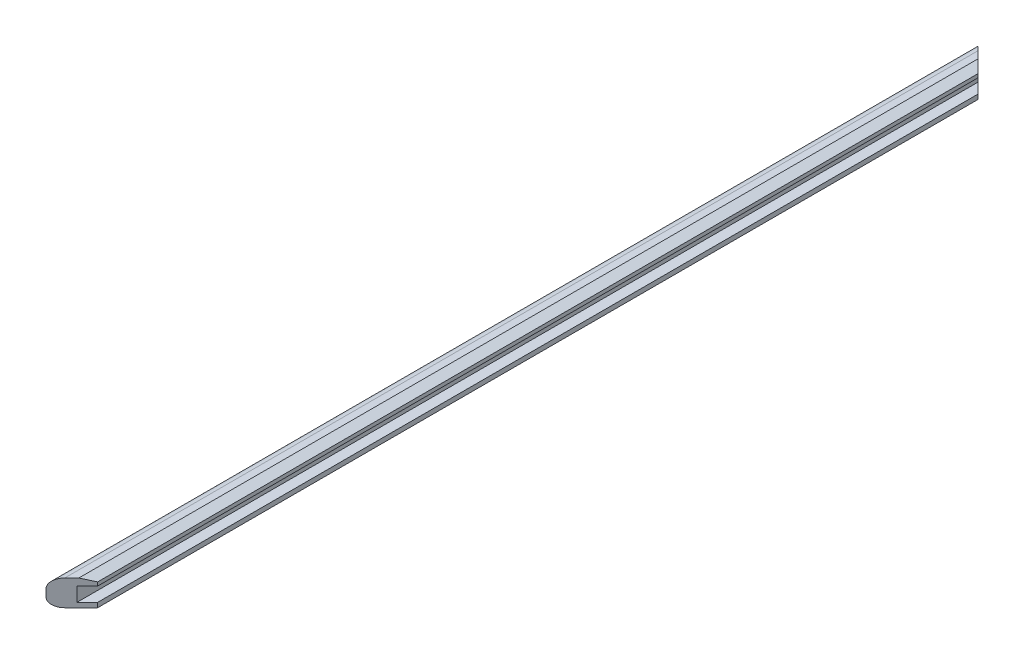
ISO-10303-21;
HEADER;
FILE_DESCRIPTION(('STEP AP214'),'2;1');
FILE_NAME('part.step','',(''),(''),'','','');
FILE_SCHEMA(('AUTOMOTIVE_DESIGN { 1 0 10303 214 1 1 1 1 }'));
ENDSEC;
DATA;
#1=APPLICATION_CONTEXT('core data for automotive mechanical design processes');
#2=APPLICATION_PROTOCOL_DEFINITION('international standard','automotive_design',2000,#1);
#3=PRODUCT_CONTEXT('',#1,'mechanical');
#4=PRODUCT('Part','Part','',(#3));
#5=PRODUCT_RELATED_PRODUCT_CATEGORY('part','',(#4));
#6=PRODUCT_DEFINITION_FORMATION('','',#4);
#7=PRODUCT_DEFINITION_CONTEXT('part definition',#1,'design');
#8=PRODUCT_DEFINITION('design','',#6,#7);
#9=PRODUCT_DEFINITION_SHAPE('','',#8);
#10=(LENGTH_UNIT() NAMED_UNIT(*) SI_UNIT(.MILLI.,.METRE.));
#11=(NAMED_UNIT(*) PLANE_ANGLE_UNIT() SI_UNIT($,.RADIAN.));
#12=(NAMED_UNIT(*) SI_UNIT($,.STERADIAN.) SOLID_ANGLE_UNIT());
#13=UNCERTAINTY_MEASURE_WITH_UNIT(LENGTH_MEASURE(1.E-05),#10,'distance_accuracy_value','');
#14=(GEOMETRIC_REPRESENTATION_CONTEXT(3) GLOBAL_UNCERTAINTY_ASSIGNED_CONTEXT((#13)) GLOBAL_UNIT_ASSIGNED_CONTEXT((#10,
#11,#12)) REPRESENTATION_CONTEXT('',''));
#15=CARTESIAN_POINT('',(0.,0.,0.));
#16=DIRECTION('',(0.,0.,1.));
#17=DIRECTION('',(1.,0.,0.));
#18=AXIS2_PLACEMENT_3D('',#15,#16,#17);
#19=CARTESIAN_POINT('',(17.4625,-17.4625,-1320.8));
#20=DIRECTION('',(1.,0.,0.));
#21=DIRECTION('',(0.,0.,-1.));
#22=AXIS2_PLACEMENT_3D('',#19,#20,#21);
#23=PLANE('',#22);
#24=DIRECTION('',(0.,1.,0.));
#25=VECTOR('',#24,1.);
#26=CARTESIAN_POINT('',(17.4625,-17.4625,-1226.185));
#27=LINE('',#26,#25);
#28=CARTESIAN_POINT('',(17.4625,-17.4625,-1226.185));
#29=VERTEX_POINT('',#28);
#30=CARTESIAN_POINT('',(17.4625,-11.1125,-1226.185));
#31=VERTEX_POINT('',#30);
#32=EDGE_CURVE('E117',#29,#31,#27,.T.);
#33=ORIENTED_EDGE('',*,*,#32,.T.);
#34=DIRECTION('',(0.,0.,1.));
#35=VECTOR('',#34,1.);
#36=CARTESIAN_POINT('',(17.4625,-11.1125,-1320.8));
#37=LINE('',#36,#35);
#38=CARTESIAN_POINT('',(17.4625,-11.1125,-34.9249999999996));
#39=VERTEX_POINT('',#38);
#40=EDGE_CURVE('E155',#31,#39,#37,.T.);
#41=ORIENTED_EDGE('',*,*,#40,.T.);
#42=DIRECTION('',(0.,1.,0.));
#43=VECTOR('',#42,1.);
#44=CARTESIAN_POINT('',(17.4625,-17.4625,-34.9249999999996));
#45=LINE('',#44,#43);
#46=CARTESIAN_POINT('',(17.4625,-17.4625,-34.9249999999996));
#47=VERTEX_POINT('',#46);
#48=EDGE_CURVE('E143',#47,#39,#45,.T.);
#49=ORIENTED_EDGE('',*,*,#48,.F.);
#50=DIRECTION('',(0.,0.,1.));
#51=VECTOR('',#50,1.);
#52=CARTESIAN_POINT('',(17.4625,-17.4625,-1320.8));
#53=LINE('',#52,#51);
#54=EDGE_CURVE('E134',#29,#47,#53,.T.);
#55=ORIENTED_EDGE('',*,*,#54,.F.);
#56=EDGE_LOOP('',(#33,#41,#49,#55));
#57=FACE_BOUND('',#56,.T.);
#58=ADVANCED_FACE('F34',(#57),#23,.T.);
#59=CARTESIAN_POINT('',(17.4625,7.93749999999999,-1226.185));
#60=VERTEX_POINT('',#59);
#61=CARTESIAN_POINT('',(17.4625,12.8400780248192,-1226.185));
#62=VERTEX_POINT('',#61);
#63=EDGE_CURVE('E128',#60,#62,#27,.T.);
#64=ORIENTED_EDGE('',*,*,#63,.T.);
#65=DIRECTION('',(0.,0.,1.));
#66=VECTOR('',#65,1.);
#67=CARTESIAN_POINT('',(17.4625,12.8400780248192,-1320.8));
#68=LINE('',#67,#66);
#69=CARTESIAN_POINT('',(17.4625,12.8400780248192,-34.9249999999996));
#70=VERTEX_POINT('',#69);
#71=EDGE_CURVE('E57',#62,#70,#68,.T.);
#72=ORIENTED_EDGE('',*,*,#71,.T.);
#73=CARTESIAN_POINT('',(17.4625,7.93749999999999,-34.9249999999996));
#74=VERTEX_POINT('',#73);
#75=EDGE_CURVE('E178',#74,#70,#45,.T.);
#76=ORIENTED_EDGE('',*,*,#75,.F.);
#77=DIRECTION('',(0.,0.,1.));
#78=VECTOR('',#77,1.);
#79=CARTESIAN_POINT('',(17.4625,7.93749999999999,-1320.8));
#80=LINE('',#79,#78);
#81=EDGE_CURVE('E189',#60,#74,#80,.T.);
#82=ORIENTED_EDGE('',*,*,#81,.F.);
#83=EDGE_LOOP('',(#64,#72,#76,#82));
#84=FACE_BOUND('',#83,.T.);
#85=ADVANCED_FACE('F188',(#84),#23,.T.);
#86=CARTESIAN_POINT('',(-17.4625,-17.4625,-1320.8));
#87=DIRECTION('',(0.,-1.,0.));
#88=DIRECTION('',(0.,0.,-1.));
#89=AXIS2_PLACEMENT_3D('',#86,#87,#88);
#90=PLANE('',#89);
#91=DIRECTION('',(0.707106781186551,0.,0.707106781186544));
#92=VECTOR('',#91,1.);
#93=CARTESIAN_POINT('',(-17.4625,-17.4625,-1261.11));
#94=LINE('',#93,#92);
#95=CARTESIAN_POINT('',(-4.7625,-17.4625,-1248.41));
#96=VERTEX_POINT('',#95);
#97=EDGE_CURVE('E120',#96,#29,#94,.T.);
#98=ORIENTED_EDGE('',*,*,#97,.T.);
#99=ORIENTED_EDGE('',*,*,#54,.T.);
#100=DIRECTION('',(-0.707106781186551,0.,0.707106781186544));
#101=VECTOR('',#100,1.);
#102=CARTESIAN_POINT('',(-17.4625,-17.4625,0.));
#103=LINE('',#102,#101);
#104=CARTESIAN_POINT('',(-4.76249999999998,-17.4625,-12.6999999999999));
#105=VERTEX_POINT('',#104);
#106=EDGE_CURVE('E184',#47,#105,#103,.T.);
#107=ORIENTED_EDGE('',*,*,#106,.T.);
#108=DIRECTION('',(0.,0.,1.));
#109=VECTOR('',#108,1.);
#110=CARTESIAN_POINT('',(-4.7625,-17.4625,-1320.8));
#111=LINE('',#110,#109);
#112=EDGE_CURVE('E137',#105,#96,#111,.F.);
#113=ORIENTED_EDGE('',*,*,#112,.T.);
#114=EDGE_LOOP('',(#98,#99,#107,#113));
#115=FACE_BOUND('',#114,.T.);
#116=ADVANCED_FACE('F132',(#115),#90,.T.);
#117=CARTESIAN_POINT('',(-17.4625,-17.4625,-1320.8));
#118=DIRECTION('',(-1.,0.,0.));
#119=DIRECTION('',(0.,0.,1.));
#120=AXIS2_PLACEMENT_3D('',#117,#118,#119);
#121=PLANE('',#120);
#122=DIRECTION('',(0.,1.,0.));
#123=VECTOR('',#122,1.);
#124=CARTESIAN_POINT('',(-17.4625,-17.4625,-1261.11));
#125=LINE('',#124,#123);
#126=CARTESIAN_POINT('',(-17.4625,-4.7625,-1261.11));
#127=VERTEX_POINT('',#126);
#128=CARTESIAN_POINT('',(-17.4625,4.76249999999999,-1261.11));
#129=VERTEX_POINT('',#128);
#130=EDGE_CURVE('E139',#127,#129,#125,.T.);
#131=ORIENTED_EDGE('',*,*,#130,.F.);
#132=DIRECTION('',(0.,0.,1.));
#133=VECTOR('',#132,1.);
#134=CARTESIAN_POINT('',(-17.4625,-4.7625,-1320.8));
#135=LINE('',#134,#133);
#136=CARTESIAN_POINT('',(-17.4625,-4.7625,0.));
#137=VERTEX_POINT('',#136);
#138=EDGE_CURVE('E152',#127,#137,#135,.T.);
#139=ORIENTED_EDGE('',*,*,#138,.T.);
#140=DIRECTION('',(0.,-1.,0.));
#141=VECTOR('',#140,1.);
#142=CARTESIAN_POINT('',(-17.4625,-17.4625,0.));
#143=LINE('',#142,#141);
#144=CARTESIAN_POINT('',(-17.4625,4.76249999999999,0.));
#145=VERTEX_POINT('',#144);
#146=EDGE_CURVE('E146',#145,#137,#143,.T.);
#147=ORIENTED_EDGE('',*,*,#146,.F.);
#148=DIRECTION('',(0.,0.,1.));
#149=VECTOR('',#148,1.);
#150=CARTESIAN_POINT('',(-17.4625,4.76249999999999,-1320.8));
#151=LINE('',#150,#149);
#152=EDGE_CURVE('E145',#145,#129,#151,.F.);
#153=ORIENTED_EDGE('',*,*,#152,.T.);
#154=EDGE_LOOP('',(#131,#139,#147,#153));
#155=FACE_BOUND('',#154,.T.);
#156=ADVANCED_FACE('F245',(#155),#121,.T.);
#157=CARTESIAN_POINT('',(-17.4625,17.4625,-1320.8));
#158=DIRECTION('',(0.,1.,0.));
#159=DIRECTION('',(0.,0.,1.));
#160=AXIS2_PLACEMENT_3D('',#157,#158,#159);
#161=PLANE('',#160);
#162=DIRECTION('',(0.707106781186551,0.,0.707106781186544));
#163=VECTOR('',#162,1.);
#164=CARTESIAN_POINT('',(-17.4625,17.4625,-1261.11));
#165=LINE('',#164,#163);
#166=CARTESIAN_POINT('',(-4.7625,17.4625,-1248.41));
#167=VERTEX_POINT('',#166);
#168=CARTESIAN_POINT('',(4.76249999999983,17.4625,-1238.885));
#169=VERTEX_POINT('',#168);
#170=EDGE_CURVE('E49',#167,#169,#165,.T.);
#171=ORIENTED_EDGE('',*,*,#170,.F.);
#172=DIRECTION('',(0.,0.,1.));
#173=VECTOR('',#172,1.);
#174=CARTESIAN_POINT('',(-4.7625,17.4625,-1320.8));
#175=LINE('',#174,#173);
#176=CARTESIAN_POINT('',(-4.76249999999998,17.4625,-12.6999999999999));
#177=VERTEX_POINT('',#176);
#178=EDGE_CURVE('E162',#167,#177,#175,.T.);
#179=ORIENTED_EDGE('',*,*,#178,.T.);
#180=DIRECTION('',(-0.707106781186551,0.,0.707106781186544));
#181=VECTOR('',#180,1.);
#182=CARTESIAN_POINT('',(-17.4625,17.4625,0.));
#183=LINE('',#182,#181);
#184=CARTESIAN_POINT('',(4.76249999999984,17.4625,-22.2249999999997));
#185=VERTEX_POINT('',#184);
#186=EDGE_CURVE('E175',#185,#177,#183,.T.);
#187=ORIENTED_EDGE('',*,*,#186,.F.);
#188=DIRECTION('',(0.,0.,-1.));
#189=VECTOR('',#188,1.);
#190=CARTESIAN_POINT('',(4.76249999999983,17.4625,-1320.8));
#191=LINE('',#190,#189);
#192=EDGE_CURVE('E167',#185,#169,#191,.T.);
#193=ORIENTED_EDGE('',*,*,#192,.T.);
#194=EDGE_LOOP('',(#171,#179,#187,#193));
#195=FACE_BOUND('',#194,.T.);
#196=ADVANCED_FACE('F182',(#195),#161,.T.);
#197=CARTESIAN_POINT('',(17.4625,-11.1125,-1320.8));
#198=DIRECTION('',(0.,-1.,0.));
#199=DIRECTION('',(1.,0.,0.));
#200=AXIS2_PLACEMENT_3D('',#197,#198,#199);
#201=PLANE('',#200);
#202=ORIENTED_EDGE('',*,*,#40,.F.);
#203=DIRECTION('',(-0.707106781186551,0.,-0.707106781186544));
#204=VECTOR('',#203,1.);
#205=CARTESIAN_POINT('',(-29.8449999999998,-11.1125,-1273.4925));
#206=LINE('',#205,#204);
#207=CARTESIAN_POINT('',(3.49249999999999,-11.1125,-1240.155));
#208=VERTEX_POINT('',#207);
#209=EDGE_CURVE('E123',#31,#208,#206,.T.);
#210=ORIENTED_EDGE('',*,*,#209,.T.);
#211=DIRECTION('',(0.,0.,1.));
#212=VECTOR('',#211,1.);
#213=CARTESIAN_POINT('',(3.49249999999999,-11.1125,-1320.8));
#214=LINE('',#213,#212);
#215=CARTESIAN_POINT('',(3.49249999999999,-11.1125,-20.9549999999998));
#216=VERTEX_POINT('',#215);
#217=EDGE_CURVE('E224',#208,#216,#214,.T.);
#218=ORIENTED_EDGE('',*,*,#217,.T.);
#219=DIRECTION('',(0.707106781186551,0.,-0.707106781186544));
#220=VECTOR('',#219,1.);
#221=CARTESIAN_POINT('',(660.4,-11.1124999999998,-677.862499999993));
#222=LINE('',#221,#220);
#223=EDGE_CURVE('E219',#216,#39,#222,.T.);
#224=ORIENTED_EDGE('',*,*,#223,.T.);
#225=EDGE_LOOP('',(#202,#210,#218,#224));
#226=FACE_BOUND('',#225,.T.);
#227=ADVANCED_FACE('F237',(#226),#201,.F.);
#228=CARTESIAN_POINT('',(3.49249999999999,7.93749999999999,-1320.8));
#229=DIRECTION('',(-1.,0.,0.));
#230=DIRECTION('',(0.,-1.,0.));
#231=AXIS2_PLACEMENT_3D('',#228,#229,#230);
#232=PLANE('',#231);
#233=ORIENTED_EDGE('',*,*,#217,.F.);
#234=DIRECTION('',(0.,1.,0.));
#235=VECTOR('',#234,1.);
#236=CARTESIAN_POINT('',(3.49249999999999,7.9375,-1240.155));
#237=LINE('',#236,#235);
#238=CARTESIAN_POINT('',(3.4925,7.93749999999999,-1240.155));
#239=VERTEX_POINT('',#238);
#240=EDGE_CURVE('E200',#208,#239,#237,.T.);
#241=ORIENTED_EDGE('',*,*,#240,.T.);
#242=DIRECTION('',(0.,0.,1.));
#243=VECTOR('',#242,1.);
#244=CARTESIAN_POINT('',(3.49249999999999,7.93749999999999,-1320.8));
#245=LINE('',#244,#243);
#246=CARTESIAN_POINT('',(3.49250000000001,7.93749999999999,-20.9549999999995));
#247=VERTEX_POINT('',#246);
#248=EDGE_CURVE('E226',#239,#247,#245,.T.);
#249=ORIENTED_EDGE('',*,*,#248,.T.);
#250=DIRECTION('',(0.,-1.,0.));
#251=VECTOR('',#250,1.);
#252=CARTESIAN_POINT('',(3.49249999999999,7.93749999999987,-20.9549999999998));
#253=LINE('',#252,#251);
#254=EDGE_CURVE('E215',#247,#216,#253,.T.);
#255=ORIENTED_EDGE('',*,*,#254,.T.);
#256=EDGE_LOOP('',(#233,#241,#249,#255));
#257=FACE_BOUND('',#256,.T.);
#258=ADVANCED_FACE('F235',(#257),#232,.F.);
#259=CARTESIAN_POINT('',(17.4625,7.93749999999999,-1320.8));
#260=DIRECTION('',(0.,1.,0.));
#261=DIRECTION('',(0.,0.,1.));
#262=AXIS2_PLACEMENT_3D('',#259,#260,#261);
#263=PLANE('',#262);
#264=ORIENTED_EDGE('',*,*,#248,.F.);
#265=DIRECTION('',(0.707106781186551,0.,0.707106781186544));
#266=VECTOR('',#265,1.);
#267=CARTESIAN_POINT('',(-29.8449999999998,7.93749999999999,-1273.4925));
#268=LINE('',#267,#266);
#269=EDGE_CURVE('E197',#239,#60,#268,.T.);
#270=ORIENTED_EDGE('',*,*,#269,.T.);
#271=ORIENTED_EDGE('',*,*,#81,.T.);
#272=DIRECTION('',(-0.707106781186551,0.,0.707106781186544));
#273=VECTOR('',#272,1.);
#274=CARTESIAN_POINT('',(660.4,7.93749999999999,-677.862499999993));
#275=LINE('',#274,#273);
#276=EDGE_CURVE('E212',#74,#247,#275,.T.);
#277=ORIENTED_EDGE('',*,*,#276,.T.);
#278=EDGE_LOOP('',(#264,#270,#271,#277));
#279=FACE_BOUND('',#278,.T.);
#280=ADVANCED_FACE('F231',(#279),#263,.F.);
#281=CARTESIAN_POINT('',(-4.7625,-4.7625,-1320.8));
#282=DIRECTION('',(0.,0.,1.));
#283=DIRECTION('',(1.,0.,0.));
#284=AXIS2_PLACEMENT_3D('',#281,#282,#283);
#285=CYLINDRICAL_SURFACE('',#284,12.7);
#286=CARTESIAN_POINT('',(-4.7625,-4.7625,-1248.41));
#287=DIRECTION('',(-0.707106781186544,0.,0.707106781186551));
#288=DIRECTION('',(0.707106781186551,0.,0.707106781186544));
#289=AXIS2_PLACEMENT_3D('',#286,#287,#288);
#290=ELLIPSE('',#289,17.9605122421382,12.7);
#291=EDGE_CURVE('E195',#96,#127,#290,.F.);
#292=ORIENTED_EDGE('',*,*,#291,.F.);
#293=ORIENTED_EDGE('',*,*,#112,.F.);
#294=CARTESIAN_POINT('',(-4.7625,-4.7625,-12.6999999999999));
#295=DIRECTION('',(-0.707106781186544,0.,-0.707106781186551));
#296=DIRECTION('',(-0.707106781186551,0.,0.707106781186544));
#297=AXIS2_PLACEMENT_3D('',#294,#295,#296);
#298=ELLIPSE('',#297,17.9605122421382,12.7);
#299=EDGE_CURVE('E210',#137,#105,#298,.F.);
#300=ORIENTED_EDGE('',*,*,#299,.F.);
#301=ORIENTED_EDGE('',*,*,#138,.F.);
#302=EDGE_LOOP('',(#292,#293,#300,#301));
#303=FACE_BOUND('',#302,.T.);
#304=ADVANCED_FACE('F240',(#303),#285,.T.);
#305=CARTESIAN_POINT('',(-4.7625,4.76249999999999,-1320.8));
#306=DIRECTION('',(0.,0.,1.));
#307=DIRECTION('',(1.,0.,0.));
#308=AXIS2_PLACEMENT_3D('',#305,#306,#307);
#309=CYLINDRICAL_SURFACE('',#308,12.7);
#310=CARTESIAN_POINT('',(-4.7625,4.76249999999999,-1248.41));
#311=DIRECTION('',(-0.707106781186544,0.,0.707106781186551));
#312=DIRECTION('',(0.707106781186551,0.,0.707106781186544));
#313=AXIS2_PLACEMENT_3D('',#310,#311,#312);
#314=ELLIPSE('',#313,17.9605122421382,12.7);
#315=EDGE_CURVE('E127',#129,#167,#314,.F.);
#316=ORIENTED_EDGE('',*,*,#315,.F.);
#317=ORIENTED_EDGE('',*,*,#152,.F.);
#318=CARTESIAN_POINT('',(-4.7625,4.76249999999999,-12.6999999999999));
#319=DIRECTION('',(-0.707106781186544,0.,-0.707106781186551));
#320=DIRECTION('',(-0.707106781186551,0.,0.707106781186544));
#321=AXIS2_PLACEMENT_3D('',#318,#319,#320);
#322=ELLIPSE('',#321,17.9605122421382,12.7);
#323=EDGE_CURVE('E208',#177,#145,#322,.F.);
#324=ORIENTED_EDGE('',*,*,#323,.F.);
#325=ORIENTED_EDGE('',*,*,#178,.F.);
#326=EDGE_LOOP('',(#316,#317,#324,#325));
#327=FACE_BOUND('',#326,.T.);
#328=ADVANCED_FACE('F249',(#327),#309,.T.);
#329=CARTESIAN_POINT('',(17.4625,12.8400780248192,-1320.8));
#330=DIRECTION('',(-0.342020143325664,-0.93969262078591,0.));
#331=DIRECTION('',(0.,0.,1.));
#332=AXIS2_PLACEMENT_3D('',#329,#330,#331);
#333=PLANE('',#332);
#334=DIRECTION('',(-0.68479107877174,0.249243569363952,-0.684791078771733));
#335=VECTOR('',#334,1.);
#336=CARTESIAN_POINT('',(-26.9061466024063,28.9889447227711,-1270.55364660241));
#337=LINE('',#336,#335);
#338=EDGE_CURVE('E11',#169,#62,#337,.F.);
#339=ORIENTED_EDGE('',*,*,#338,.F.);
#340=ORIENTED_EDGE('',*,*,#192,.F.);
#341=DIRECTION('',(0.68479107877174,-0.249243569363952,-0.684791078771733));
#342=VECTOR('',#341,1.);
#343=CARTESIAN_POINT('',(620.459207180355,-206.63277474936,-637.921707180349));
#344=LINE('',#343,#342);
#345=EDGE_CURVE('E43',#70,#185,#344,.F.);
#346=ORIENTED_EDGE('',*,*,#345,.F.);
#347=ORIENTED_EDGE('',*,*,#71,.F.);
#348=EDGE_LOOP('',(#339,#340,#346,#347));
#349=FACE_BOUND('',#348,.T.);
#350=ADVANCED_FACE('F36',(#349),#333,.F.);
#351=CARTESIAN_POINT('',(-17.4625,-17.4625,0.));
#352=DIRECTION('',(-0.707106781186544,0.,-0.707106781186551));
#353=DIRECTION('',(-0.707106781186551,0.,0.707106781186544));
#354=AXIS2_PLACEMENT_3D('',#351,#352,#353);
#355=PLANE('',#354);
#356=ORIENTED_EDGE('',*,*,#254,.F.);
#357=ORIENTED_EDGE('',*,*,#276,.F.);
#358=ORIENTED_EDGE('',*,*,#75,.T.);
#359=ORIENTED_EDGE('',*,*,#345,.T.);
#360=ORIENTED_EDGE('',*,*,#186,.T.);
#361=ORIENTED_EDGE('',*,*,#323,.T.);
#362=ORIENTED_EDGE('',*,*,#146,.T.);
#363=ORIENTED_EDGE('',*,*,#299,.T.);
#364=ORIENTED_EDGE('',*,*,#106,.F.);
#365=ORIENTED_EDGE('',*,*,#48,.T.);
#366=ORIENTED_EDGE('',*,*,#223,.F.);
#367=EDGE_LOOP('',(#356,#357,#358,#359,#360,#361,#362,#363,#364,#365,#366));
#368=FACE_BOUND('',#367,.T.);
#369=ADVANCED_FACE('F174',(#368),#355,.F.);
#370=CARTESIAN_POINT('',(-17.4625,-17.4625,-1261.11));
#371=DIRECTION('',(-0.707106781186544,0.,0.707106781186551));
#372=DIRECTION('',(0.707106781186551,0.,0.707106781186544));
#373=AXIS2_PLACEMENT_3D('',#370,#371,#372);
#374=PLANE('',#373);
#375=ORIENTED_EDGE('',*,*,#32,.F.);
#376=ORIENTED_EDGE('',*,*,#97,.F.);
#377=ORIENTED_EDGE('',*,*,#291,.T.);
#378=ORIENTED_EDGE('',*,*,#130,.T.);
#379=ORIENTED_EDGE('',*,*,#315,.T.);
#380=ORIENTED_EDGE('',*,*,#170,.T.);
#381=ORIENTED_EDGE('',*,*,#338,.T.);
#382=ORIENTED_EDGE('',*,*,#63,.F.);
#383=ORIENTED_EDGE('',*,*,#269,.F.);
#384=ORIENTED_EDGE('',*,*,#240,.F.);
#385=ORIENTED_EDGE('',*,*,#209,.F.);
#386=EDGE_LOOP('',(#375,#376,#377,#378,#379,#380,#381,#382,#383,#384,#385));
#387=FACE_BOUND('',#386,.T.);
#388=ADVANCED_FACE('F119',(#387),#374,.F.);
#389=CLOSED_SHELL('',(#58,#85,#116,#156,#196,#227,#258,#280,#304,#328,#350,#369,#388));
#390=MANIFOLD_SOLID_BREP('B2',#389);
#391=ADVANCED_BREP_SHAPE_REPRESENTATION('',(#18,#390),#14);
#392=SHAPE_DEFINITION_REPRESENTATION(#9,#391);
ENDSEC;
END-ISO-10303-21;
